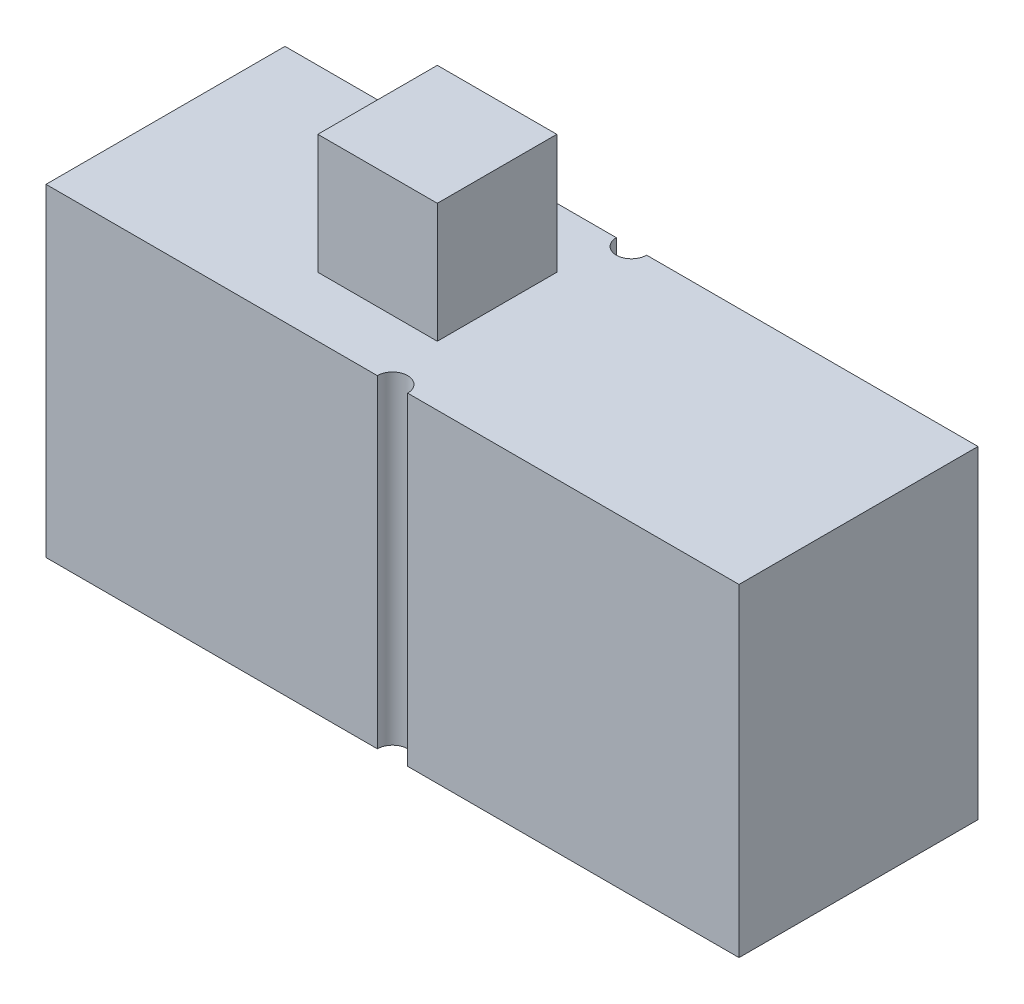
ISO-10303-21;
HEADER;
FILE_DESCRIPTION(('STEP AP214'),'2;1');
FILE_NAME('part.step','',(''),(''),'','','');
FILE_SCHEMA(('AUTOMOTIVE_DESIGN { 1 0 10303 214 1 1 1 1 }'));
ENDSEC;
DATA;
#1=APPLICATION_CONTEXT('core data for automotive mechanical design processes');
#2=APPLICATION_PROTOCOL_DEFINITION('international standard','automotive_design',2000,#1);
#3=PRODUCT_CONTEXT('',#1,'mechanical');
#4=PRODUCT('Part','Part','',(#3));
#5=PRODUCT_RELATED_PRODUCT_CATEGORY('part','',(#4));
#6=PRODUCT_DEFINITION_FORMATION('','',#4);
#7=PRODUCT_DEFINITION_CONTEXT('part definition',#1,'design');
#8=PRODUCT_DEFINITION('design','',#6,#7);
#9=PRODUCT_DEFINITION_SHAPE('','',#8);
#10=(LENGTH_UNIT() NAMED_UNIT(*) SI_UNIT(.MILLI.,.METRE.));
#11=(NAMED_UNIT(*) PLANE_ANGLE_UNIT() SI_UNIT($,.RADIAN.));
#12=(NAMED_UNIT(*) SI_UNIT($,.STERADIAN.) SOLID_ANGLE_UNIT());
#13=UNCERTAINTY_MEASURE_WITH_UNIT(LENGTH_MEASURE(1.E-05),#10,'distance_accuracy_value','');
#14=(GEOMETRIC_REPRESENTATION_CONTEXT(3) GLOBAL_UNCERTAINTY_ASSIGNED_CONTEXT((#13)) GLOBAL_UNIT_ASSIGNED_CONTEXT((#10,
#11,#12)) REPRESENTATION_CONTEXT('',''));
#15=CARTESIAN_POINT('',(0.,0.,0.));
#16=DIRECTION('',(0.,0.,1.));
#17=DIRECTION('',(1.,0.,0.));
#18=AXIS2_PLACEMENT_3D('',#15,#16,#17);
#19=CARTESIAN_POINT('',(0.,0.,4.));
#20=DIRECTION('',(0.,0.,-1.));
#21=DIRECTION('',(-1.,0.,0.));
#22=AXIS2_PLACEMENT_3D('',#19,#20,#21);
#23=PLANE('',#22);
#24=DIRECTION('',(1.,0.,0.));
#25=VECTOR('',#24,1.);
#26=CARTESIAN_POINT('',(-5.8,-2.7051,4.));
#27=LINE('',#26,#25);
#28=CARTESIAN_POINT('',(-5.8,-2.7051,4.));
#29=VERTEX_POINT('',#28);
#30=CARTESIAN_POINT('',(-0.254,-2.7051,4.));
#31=VERTEX_POINT('',#30);
#32=EDGE_CURVE('E134',#29,#31,#27,.T.);
#33=ORIENTED_EDGE('',*,*,#32,.T.);
#34=DIRECTION('',(0.,1.,0.));
#35=VECTOR('',#34,1.);
#36=CARTESIAN_POINT('',(-0.254,-2.7051,4.));
#37=LINE('',#36,#35);
#38=CARTESIAN_POINT('',(-0.254,2.7051,4.));
#39=VERTEX_POINT('',#38);
#40=EDGE_CURVE('E120',#31,#39,#37,.T.);
#41=ORIENTED_EDGE('',*,*,#40,.T.);
#42=DIRECTION('',(-1.,0.,0.));
#43=VECTOR('',#42,1.);
#44=CARTESIAN_POINT('',(-5.8,2.7051,4.));
#45=LINE('',#44,#43);
#46=CARTESIAN_POINT('',(-5.8,2.7051,4.));
#47=VERTEX_POINT('',#46);
#48=EDGE_CURVE('E190',#39,#47,#45,.T.);
#49=ORIENTED_EDGE('',*,*,#48,.T.);
#50=DIRECTION('',(0.,-1.,0.));
#51=VECTOR('',#50,1.);
#52=CARTESIAN_POINT('',(-5.8,-2.7051,4.));
#53=LINE('',#52,#51);
#54=EDGE_CURVE('E139',#47,#29,#53,.T.);
#55=ORIENTED_EDGE('',*,*,#54,.T.);
#56=EDGE_LOOP('',(#33,#41,#49,#55));
#57=FACE_BOUND('',#56,.T.);
#58=ADVANCED_FACE('F33',(#57),#23,.F.);
#59=CARTESIAN_POINT('',(0.,0.,0.));
#60=DIRECTION('',(0.,0.,-1.));
#61=DIRECTION('',(-1.,0.,0.));
#62=AXIS2_PLACEMENT_3D('',#59,#60,#61);
#63=PLANE('',#62);
#64=DIRECTION('',(0.,1.,0.));
#65=VECTOR('',#64,1.);
#66=CARTESIAN_POINT('',(-0.254,-2.7051,0.));
#67=LINE('',#66,#65);
#68=CARTESIAN_POINT('',(-0.254,-2.7051,0.));
#69=VERTEX_POINT('',#68);
#70=CARTESIAN_POINT('',(-0.254,2.7051,0.));
#71=VERTEX_POINT('',#70);
#72=EDGE_CURVE('E175',#69,#71,#67,.T.);
#73=ORIENTED_EDGE('',*,*,#72,.F.);
#74=DIRECTION('',(1.,0.,0.));
#75=VECTOR('',#74,1.);
#76=CARTESIAN_POINT('',(-5.8,-2.7051,0.));
#77=LINE('',#76,#75);
#78=CARTESIAN_POINT('',(-5.8,-2.7051,0.));
#79=VERTEX_POINT('',#78);
#80=EDGE_CURVE('E160',#79,#69,#77,.T.);
#81=ORIENTED_EDGE('',*,*,#80,.F.);
#82=DIRECTION('',(0.,-1.,0.));
#83=VECTOR('',#82,1.);
#84=CARTESIAN_POINT('',(-5.8,-2.7051,0.));
#85=LINE('',#84,#83);
#86=CARTESIAN_POINT('',(-5.8,2.7051,0.));
#87=VERTEX_POINT('',#86);
#88=EDGE_CURVE('E157',#87,#79,#85,.T.);
#89=ORIENTED_EDGE('',*,*,#88,.F.);
#90=DIRECTION('',(-1.,0.,0.));
#91=VECTOR('',#90,1.);
#92=CARTESIAN_POINT('',(-5.8,2.7051,0.));
#93=LINE('',#92,#91);
#94=EDGE_CURVE('E152',#71,#87,#93,.T.);
#95=ORIENTED_EDGE('',*,*,#94,.F.);
#96=EDGE_LOOP('',(#73,#81,#89,#95));
#97=FACE_BOUND('',#96,.T.);
#98=ADVANCED_FACE('F174',(#97),#63,.T.);
#99=CARTESIAN_POINT('',(-5.8,2.7051,4.));
#100=DIRECTION('',(0.,-1.,0.));
#101=DIRECTION('',(0.,0.,-1.));
#102=AXIS2_PLACEMENT_3D('',#99,#100,#101);
#103=PLANE('',#102);
#104=ORIENTED_EDGE('',*,*,#48,.F.);
#105=CARTESIAN_POINT('',(0.,2.7051,4.));
#106=DIRECTION('',(0.,-1.,0.));
#107=DIRECTION('',(0.,0.,-1.));
#108=AXIS2_PLACEMENT_3D('',#105,#106,#107);
#109=CIRCLE('',#108,0.254);
#110=CARTESIAN_POINT('',(0.254,2.7051,4.));
#111=VERTEX_POINT('',#110);
#112=EDGE_CURVE('E123',#39,#111,#109,.T.);
#113=ORIENTED_EDGE('',*,*,#112,.T.);
#114=CARTESIAN_POINT('',(5.8,2.7051,4.));
#115=VERTEX_POINT('',#114);
#116=EDGE_CURVE('E192',#115,#111,#45,.T.);
#117=ORIENTED_EDGE('',*,*,#116,.F.);
#118=DIRECTION('',(0.,0.,-1.));
#119=VECTOR('',#118,1.);
#120=CARTESIAN_POINT('',(5.8,2.7051,4.));
#121=LINE('',#120,#119);
#122=CARTESIAN_POINT('',(5.8,2.7051,0.));
#123=VERTEX_POINT('',#122);
#124=EDGE_CURVE('E11',#115,#123,#121,.T.);
#125=ORIENTED_EDGE('',*,*,#124,.T.);
#126=CARTESIAN_POINT('',(0.254,2.7051,0.));
#127=VERTEX_POINT('',#126);
#128=EDGE_CURVE('E154',#123,#127,#93,.T.);
#129=ORIENTED_EDGE('',*,*,#128,.T.);
#130=CARTESIAN_POINT('',(0.,2.7051,0.));
#131=DIRECTION('',(0.,-1.,0.));
#132=DIRECTION('',(0.,0.,-1.));
#133=AXIS2_PLACEMENT_3D('',#130,#131,#132);
#134=CIRCLE('',#133,0.254);
#135=EDGE_CURVE('E56',#127,#71,#134,.T.);
#136=ORIENTED_EDGE('',*,*,#135,.T.);
#137=ORIENTED_EDGE('',*,*,#94,.T.);
#138=DIRECTION('',(0.,0.,-1.));
#139=VECTOR('',#138,1.);
#140=CARTESIAN_POINT('',(-5.8,2.7051,4.));
#141=LINE('',#140,#139);
#142=EDGE_CURVE('E41',#47,#87,#141,.T.);
#143=ORIENTED_EDGE('',*,*,#142,.F.);
#144=EDGE_LOOP('',(#104,#113,#117,#125,#129,#136,#137,#143));
#145=FACE_BOUND('',#144,.T.);
#146=DIRECTION('',(1.,0.,0.));
#147=VECTOR('',#146,1.);
#148=CARTESIAN_POINT('',(-2.25,2.7051,3.));
#149=LINE('',#148,#147);
#150=CARTESIAN_POINT('',(-2.25,2.7051,3.));
#151=VERTEX_POINT('',#150);
#152=CARTESIAN_POINT('',(-0.249999999999998,2.7051,3.));
#153=VERTEX_POINT('',#152);
#154=EDGE_CURVE('E204',#151,#153,#149,.T.);
#155=ORIENTED_EDGE('',*,*,#154,.F.);
#156=DIRECTION('',(0.,0.,1.));
#157=VECTOR('',#156,1.);
#158=CARTESIAN_POINT('',(-2.25,2.7051,1.));
#159=LINE('',#158,#157);
#160=CARTESIAN_POINT('',(-2.25,2.7051,1.));
#161=VERTEX_POINT('',#160);
#162=EDGE_CURVE('E209',#161,#151,#159,.T.);
#163=ORIENTED_EDGE('',*,*,#162,.F.);
#164=DIRECTION('',(-1.,0.,0.));
#165=VECTOR('',#164,1.);
#166=CARTESIAN_POINT('',(-2.25,2.7051,1.));
#167=LINE('',#166,#165);
#168=CARTESIAN_POINT('',(-0.249999999999999,2.7051,1.));
#169=VERTEX_POINT('',#168);
#170=EDGE_CURVE('E221',#169,#161,#167,.T.);
#171=ORIENTED_EDGE('',*,*,#170,.F.);
#172=DIRECTION('',(0.,0.,-1.));
#173=VECTOR('',#172,1.);
#174=CARTESIAN_POINT('',(-0.249999999999999,2.7051,1.));
#175=LINE('',#174,#173);
#176=EDGE_CURVE('E218',#153,#169,#175,.T.);
#177=ORIENTED_EDGE('',*,*,#176,.F.);
#178=EDGE_LOOP('',(#155,#163,#171,#177));
#179=FACE_BOUND('',#178,.T.);
#180=ADVANCED_FACE('F196',(#145,#179),#103,.F.);
#181=CARTESIAN_POINT('',(5.8,-2.7051,4.));
#182=DIRECTION('',(-1.,0.,0.));
#183=DIRECTION('',(0.,0.,1.));
#184=AXIS2_PLACEMENT_3D('',#181,#182,#183);
#185=PLANE('',#184);
#186=DIRECTION('',(0.,1.,0.));
#187=VECTOR('',#186,1.);
#188=CARTESIAN_POINT('',(5.8,-2.7051,0.));
#189=LINE('',#188,#187);
#190=CARTESIAN_POINT('',(5.8,-2.7051,0.));
#191=VERTEX_POINT('',#190);
#192=EDGE_CURVE('E149',#191,#123,#189,.T.);
#193=ORIENTED_EDGE('',*,*,#192,.T.);
#194=ORIENTED_EDGE('',*,*,#124,.F.);
#195=DIRECTION('',(0.,1.,0.));
#196=VECTOR('',#195,1.);
#197=CARTESIAN_POINT('',(5.8,-2.7051,4.));
#198=LINE('',#197,#196);
#199=CARTESIAN_POINT('',(5.8,-2.7051,4.));
#200=VERTEX_POINT('',#199);
#201=EDGE_CURVE('E162',#200,#115,#198,.T.);
#202=ORIENTED_EDGE('',*,*,#201,.F.);
#203=DIRECTION('',(0.,0.,-1.));
#204=VECTOR('',#203,1.);
#205=CARTESIAN_POINT('',(5.8,-2.7051,4.));
#206=LINE('',#205,#204);
#207=EDGE_CURVE('E141',#200,#191,#206,.T.);
#208=ORIENTED_EDGE('',*,*,#207,.T.);
#209=EDGE_LOOP('',(#193,#194,#202,#208));
#210=FACE_BOUND('',#209,.T.);
#211=ADVANCED_FACE('F35',(#210),#185,.F.);
#212=CARTESIAN_POINT('',(-5.8,-2.7051,4.));
#213=DIRECTION('',(1.,0.,0.));
#214=DIRECTION('',(0.,0.,-1.));
#215=AXIS2_PLACEMENT_3D('',#212,#213,#214);
#216=PLANE('',#215);
#217=ORIENTED_EDGE('',*,*,#88,.T.);
#218=DIRECTION('',(0.,0.,-1.));
#219=VECTOR('',#218,1.);
#220=CARTESIAN_POINT('',(-5.8,-2.7051,4.));
#221=LINE('',#220,#219);
#222=EDGE_CURVE('E144',#29,#79,#221,.T.);
#223=ORIENTED_EDGE('',*,*,#222,.F.);
#224=ORIENTED_EDGE('',*,*,#54,.F.);
#225=ORIENTED_EDGE('',*,*,#142,.T.);
#226=EDGE_LOOP('',(#217,#223,#224,#225));
#227=FACE_BOUND('',#226,.T.);
#228=ADVANCED_FACE('F168',(#227),#216,.F.);
#229=CARTESIAN_POINT('',(-5.8,-2.7051,4.));
#230=DIRECTION('',(0.,1.,0.));
#231=DIRECTION('',(0.,0.,1.));
#232=AXIS2_PLACEMENT_3D('',#229,#230,#231);
#233=PLANE('',#232);
#234=CARTESIAN_POINT('',(0.254,-2.7051,4.));
#235=VERTEX_POINT('',#234);
#236=EDGE_CURVE('E136',#235,#200,#27,.T.);
#237=ORIENTED_EDGE('',*,*,#236,.F.);
#238=CARTESIAN_POINT('',(0.,-2.7051,4.));
#239=DIRECTION('',(0.,1.,0.));
#240=DIRECTION('',(0.,0.,-1.));
#241=AXIS2_PLACEMENT_3D('',#238,#239,#240);
#242=CIRCLE('',#241,0.254);
#243=EDGE_CURVE('E48',#235,#31,#242,.T.);
#244=ORIENTED_EDGE('',*,*,#243,.T.);
#245=ORIENTED_EDGE('',*,*,#32,.F.);
#246=ORIENTED_EDGE('',*,*,#222,.T.);
#247=ORIENTED_EDGE('',*,*,#80,.T.);
#248=CARTESIAN_POINT('',(0.,-2.7051,0.));
#249=DIRECTION('',(0.,1.,0.));
#250=DIRECTION('',(0.,0.,1.));
#251=AXIS2_PLACEMENT_3D('',#248,#249,#250);
#252=CIRCLE('',#251,0.254);
#253=CARTESIAN_POINT('',(0.254,-2.7051,0.));
#254=VERTEX_POINT('',#253);
#255=EDGE_CURVE('E177',#69,#254,#252,.T.);
#256=ORIENTED_EDGE('',*,*,#255,.T.);
#257=EDGE_CURVE('E159',#254,#191,#77,.T.);
#258=ORIENTED_EDGE('',*,*,#257,.T.);
#259=ORIENTED_EDGE('',*,*,#207,.F.);
#260=EDGE_LOOP('',(#237,#244,#245,#246,#247,#256,#258,#259));
#261=FACE_BOUND('',#260,.T.);
#262=ADVANCED_FACE('F132',(#261),#233,.F.);
#263=ORIENTED_EDGE('',*,*,#116,.T.);
#264=DIRECTION('',(0.,1.,0.));
#265=VECTOR('',#264,1.);
#266=CARTESIAN_POINT('',(0.254,-2.7051,4.));
#267=LINE('',#266,#265);
#268=EDGE_CURVE('E127',#235,#111,#267,.T.);
#269=ORIENTED_EDGE('',*,*,#268,.F.);
#270=ORIENTED_EDGE('',*,*,#236,.T.);
#271=ORIENTED_EDGE('',*,*,#201,.T.);
#272=EDGE_LOOP('',(#263,#269,#270,#271));
#273=FACE_BOUND('',#272,.T.);
#274=ADVANCED_FACE('F195',(#273),#23,.F.);
#275=DIRECTION('',(0.,1.,0.));
#276=VECTOR('',#275,1.);
#277=CARTESIAN_POINT('',(0.254,-2.7051,0.));
#278=LINE('',#277,#276);
#279=EDGE_CURVE('E179',#254,#127,#278,.T.);
#280=ORIENTED_EDGE('',*,*,#279,.T.);
#281=ORIENTED_EDGE('',*,*,#128,.F.);
#282=ORIENTED_EDGE('',*,*,#192,.F.);
#283=ORIENTED_EDGE('',*,*,#257,.F.);
#284=EDGE_LOOP('',(#280,#281,#282,#283));
#285=FACE_BOUND('',#284,.T.);
#286=ADVANCED_FACE('F183',(#285),#63,.T.);
#287=CARTESIAN_POINT('',(-2.25,4.7051,3.));
#288=DIRECTION('',(0.,0.,-1.));
#289=DIRECTION('',(-1.,0.,0.));
#290=AXIS2_PLACEMENT_3D('',#287,#288,#289);
#291=PLANE('',#290);
#292=ORIENTED_EDGE('',*,*,#154,.T.);
#293=DIRECTION('',(0.,-1.,0.));
#294=VECTOR('',#293,1.);
#295=CARTESIAN_POINT('',(-0.249999999999999,4.7051,3.));
#296=LINE('',#295,#294);
#297=CARTESIAN_POINT('',(-0.249999999999999,4.7051,3.));
#298=VERTEX_POINT('',#297);
#299=EDGE_CURVE('E153',#298,#153,#296,.T.);
#300=ORIENTED_EDGE('',*,*,#299,.F.);
#301=DIRECTION('',(1.,0.,0.));
#302=VECTOR('',#301,1.);
#303=CARTESIAN_POINT('',(-2.25,4.7051,3.));
#304=LINE('',#303,#302);
#305=CARTESIAN_POINT('',(-2.25,4.7051,3.));
#306=VERTEX_POINT('',#305);
#307=EDGE_CURVE('E205',#306,#298,#304,.T.);
#308=ORIENTED_EDGE('',*,*,#307,.F.);
#309=DIRECTION('',(0.,-1.,0.));
#310=VECTOR('',#309,1.);
#311=CARTESIAN_POINT('',(-2.25,4.7051,3.));
#312=LINE('',#311,#310);
#313=EDGE_CURVE('E215',#306,#151,#312,.T.);
#314=ORIENTED_EDGE('',*,*,#313,.T.);
#315=EDGE_LOOP('',(#292,#300,#308,#314));
#316=FACE_BOUND('',#315,.T.);
#317=ADVANCED_FACE('F241',(#316),#291,.F.);
#318=CARTESIAN_POINT('',(-0.249999999999999,4.7051,1.));
#319=DIRECTION('',(-1.,0.,0.));
#320=DIRECTION('',(0.,0.,1.));
#321=AXIS2_PLACEMENT_3D('',#318,#319,#320);
#322=PLANE('',#321);
#323=ORIENTED_EDGE('',*,*,#176,.T.);
#324=DIRECTION('',(0.,-1.,0.));
#325=VECTOR('',#324,1.);
#326=CARTESIAN_POINT('',(-0.249999999999999,4.7051,1.));
#327=LINE('',#326,#325);
#328=CARTESIAN_POINT('',(-0.249999999999999,4.7051,1.));
#329=VERTEX_POINT('',#328);
#330=EDGE_CURVE('E230',#329,#169,#327,.T.);
#331=ORIENTED_EDGE('',*,*,#330,.F.);
#332=DIRECTION('',(0.,0.,-1.));
#333=VECTOR('',#332,1.);
#334=CARTESIAN_POINT('',(-0.249999999999999,4.7051,1.));
#335=LINE('',#334,#333);
#336=EDGE_CURVE('E208',#298,#329,#335,.T.);
#337=ORIENTED_EDGE('',*,*,#336,.F.);
#338=ORIENTED_EDGE('',*,*,#299,.T.);
#339=EDGE_LOOP('',(#323,#331,#337,#338));
#340=FACE_BOUND('',#339,.T.);
#341=ADVANCED_FACE('F238',(#340),#322,.F.);
#342=CARTESIAN_POINT('',(-2.25,4.7051,1.));
#343=DIRECTION('',(0.,0.,1.));
#344=DIRECTION('',(1.,0.,0.));
#345=AXIS2_PLACEMENT_3D('',#342,#343,#344);
#346=PLANE('',#345);
#347=ORIENTED_EDGE('',*,*,#170,.T.);
#348=DIRECTION('',(0.,-1.,0.));
#349=VECTOR('',#348,1.);
#350=CARTESIAN_POINT('',(-2.25,4.7051,1.));
#351=LINE('',#350,#349);
#352=CARTESIAN_POINT('',(-2.25,4.7051,1.));
#353=VERTEX_POINT('',#352);
#354=EDGE_CURVE('E228',#353,#161,#351,.T.);
#355=ORIENTED_EDGE('',*,*,#354,.F.);
#356=DIRECTION('',(-1.,0.,0.));
#357=VECTOR('',#356,1.);
#358=CARTESIAN_POINT('',(-2.25,4.7051,1.));
#359=LINE('',#358,#357);
#360=EDGE_CURVE('E211',#329,#353,#359,.T.);
#361=ORIENTED_EDGE('',*,*,#360,.F.);
#362=ORIENTED_EDGE('',*,*,#330,.T.);
#363=EDGE_LOOP('',(#347,#355,#361,#362));
#364=FACE_BOUND('',#363,.T.);
#365=ADVANCED_FACE('F247',(#364),#346,.F.);
#366=CARTESIAN_POINT('',(-2.25,4.7051,1.));
#367=DIRECTION('',(1.,0.,0.));
#368=DIRECTION('',(0.,0.,-1.));
#369=AXIS2_PLACEMENT_3D('',#366,#367,#368);
#370=PLANE('',#369);
#371=ORIENTED_EDGE('',*,*,#162,.T.);
#372=ORIENTED_EDGE('',*,*,#313,.F.);
#373=DIRECTION('',(0.,0.,1.));
#374=VECTOR('',#373,1.);
#375=CARTESIAN_POINT('',(-2.25,4.7051,1.));
#376=LINE('',#375,#374);
#377=EDGE_CURVE('E213',#353,#306,#376,.T.);
#378=ORIENTED_EDGE('',*,*,#377,.F.);
#379=ORIENTED_EDGE('',*,*,#354,.T.);
#380=EDGE_LOOP('',(#371,#372,#378,#379));
#381=FACE_BOUND('',#380,.T.);
#382=ADVANCED_FACE('F244',(#381),#370,.F.);
#383=CARTESIAN_POINT('',(0.,4.7051,0.));
#384=DIRECTION('',(0.,-1.,0.));
#385=DIRECTION('',(0.,0.,-1.));
#386=AXIS2_PLACEMENT_3D('',#383,#384,#385);
#387=PLANE('',#386);
#388=ORIENTED_EDGE('',*,*,#307,.T.);
#389=ORIENTED_EDGE('',*,*,#336,.T.);
#390=ORIENTED_EDGE('',*,*,#360,.T.);
#391=ORIENTED_EDGE('',*,*,#377,.T.);
#392=EDGE_LOOP('',(#388,#389,#390,#391));
#393=FACE_BOUND('',#392,.T.);
#394=ADVANCED_FACE('F249',(#393),#387,.F.);
#395=CARTESIAN_POINT('',(0.,-2.7051,0.));
#396=DIRECTION('',(0.,1.,0.));
#397=DIRECTION('',(0.,0.,1.));
#398=AXIS2_PLACEMENT_3D('',#395,#396,#397);
#399=CYLINDRICAL_SURFACE('',#398,0.254);
#400=ORIENTED_EDGE('',*,*,#279,.F.);
#401=ORIENTED_EDGE('',*,*,#255,.F.);
#402=ORIENTED_EDGE('',*,*,#72,.T.);
#403=ORIENTED_EDGE('',*,*,#135,.F.);
#404=EDGE_LOOP('',(#400,#401,#402,#403));
#405=FACE_BOUND('',#404,.T.);
#406=ADVANCED_FACE('F251',(#405),#399,.F.);
#407=CARTESIAN_POINT('',(0.,-2.7051,4.));
#408=DIRECTION('',(0.,1.,0.));
#409=DIRECTION('',(0.,0.,1.));
#410=AXIS2_PLACEMENT_3D('',#407,#408,#409);
#411=CYLINDRICAL_SURFACE('',#410,0.254);
#412=ORIENTED_EDGE('',*,*,#40,.F.);
#413=ORIENTED_EDGE('',*,*,#243,.F.);
#414=ORIENTED_EDGE('',*,*,#268,.T.);
#415=ORIENTED_EDGE('',*,*,#112,.F.);
#416=EDGE_LOOP('',(#412,#413,#414,#415));
#417=FACE_BOUND('',#416,.T.);
#418=ADVANCED_FACE('F121',(#417),#411,.F.);
#419=CLOSED_SHELL('',(#58,#98,#180,#211,#228,#262,#274,#286,#317,#341,#365,#382,#394,#406,#418));
#420=MANIFOLD_SOLID_BREP('B2',#419);
#421=ADVANCED_BREP_SHAPE_REPRESENTATION('',(#18,#420),#14);
#422=SHAPE_DEFINITION_REPRESENTATION(#9,#421);
ENDSEC;
END-ISO-10303-21;
